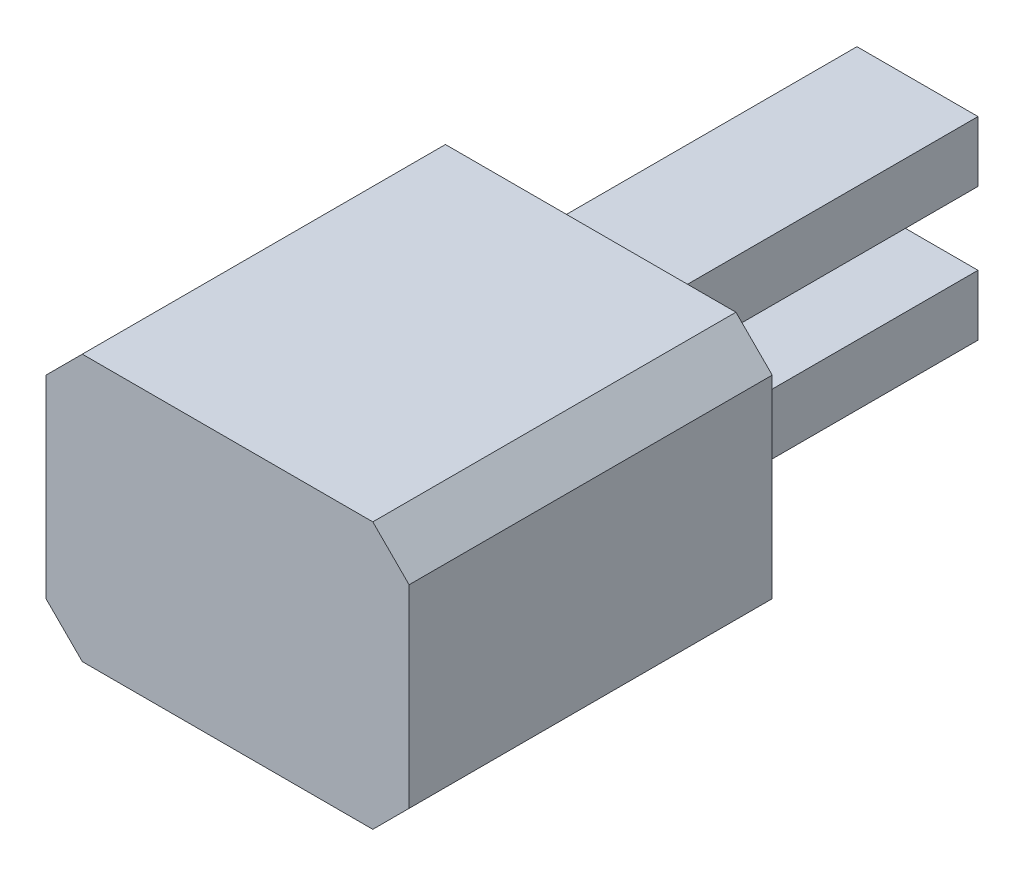
ISO-10303-21;
HEADER;
FILE_DESCRIPTION(('STEP AP214'),'2;1');
FILE_NAME('part.step','',(''),(''),'','','');
FILE_SCHEMA(('AUTOMOTIVE_DESIGN { 1 0 10303 214 1 1 1 1 }'));
ENDSEC;
DATA;
#1=APPLICATION_CONTEXT('core data for automotive mechanical design processes');
#2=APPLICATION_PROTOCOL_DEFINITION('international standard','automotive_design',2000,#1);
#3=PRODUCT_CONTEXT('',#1,'mechanical');
#4=PRODUCT('Part','Part','',(#3));
#5=PRODUCT_RELATED_PRODUCT_CATEGORY('part','',(#4));
#6=PRODUCT_DEFINITION_FORMATION('','',#4);
#7=PRODUCT_DEFINITION_CONTEXT('part definition',#1,'design');
#8=PRODUCT_DEFINITION('design','',#6,#7);
#9=PRODUCT_DEFINITION_SHAPE('','',#8);
#10=(LENGTH_UNIT() NAMED_UNIT(*) SI_UNIT(.MILLI.,.METRE.));
#11=(NAMED_UNIT(*) PLANE_ANGLE_UNIT() SI_UNIT($,.RADIAN.));
#12=(NAMED_UNIT(*) SI_UNIT($,.STERADIAN.) SOLID_ANGLE_UNIT());
#13=UNCERTAINTY_MEASURE_WITH_UNIT(LENGTH_MEASURE(1.E-05),#10,'distance_accuracy_value','');
#14=(GEOMETRIC_REPRESENTATION_CONTEXT(3) GLOBAL_UNCERTAINTY_ASSIGNED_CONTEXT((#13)) GLOBAL_UNIT_ASSIGNED_CONTEXT((#10,
#11,#12)) REPRESENTATION_CONTEXT('',''));
#15=CARTESIAN_POINT('',(0.,0.,0.));
#16=DIRECTION('',(0.,0.,1.));
#17=DIRECTION('',(1.,0.,0.));
#18=AXIS2_PLACEMENT_3D('',#15,#16,#17);
#19=CARTESIAN_POINT('',(0.,0.,-66.));
#20=DIRECTION('',(0.,0.,1.));
#21=DIRECTION('',(1.,0.,0.));
#22=AXIS2_PLACEMENT_3D('',#19,#20,#21);
#23=PLANE('',#22);
#24=DIRECTION('',(0.707106781186548,-0.707106781186548,0.));
#25=VECTOR('',#24,1.);
#26=CARTESIAN_POINT('',(-30.,-16.,-66.));
#27=LINE('',#26,#25);
#28=CARTESIAN_POINT('',(-30.,-16.,-66.));
#29=VERTEX_POINT('',#28);
#30=CARTESIAN_POINT('',(-24.,-22.,-66.));
#31=VERTEX_POINT('',#30);
#32=EDGE_CURVE('E220',#29,#31,#27,.T.);
#33=ORIENTED_EDGE('',*,*,#32,.F.);
#34=DIRECTION('',(0.,-1.,0.));
#35=VECTOR('',#34,1.);
#36=CARTESIAN_POINT('',(-30.,16.,-66.));
#37=LINE('',#36,#35);
#38=CARTESIAN_POINT('',(-30.,16.,-66.));
#39=VERTEX_POINT('',#38);
#40=EDGE_CURVE('E225',#39,#29,#37,.T.);
#41=ORIENTED_EDGE('',*,*,#40,.F.);
#42=DIRECTION('',(-0.707106781186548,-0.707106781186548,0.));
#43=VECTOR('',#42,1.);
#44=CARTESIAN_POINT('',(-24.,22.,-66.));
#45=LINE('',#44,#43);
#46=CARTESIAN_POINT('',(-24.,22.,-66.));
#47=VERTEX_POINT('',#46);
#48=EDGE_CURVE('E249',#47,#39,#45,.T.);
#49=ORIENTED_EDGE('',*,*,#48,.F.);
#50=DIRECTION('',(-1.,0.,0.));
#51=VECTOR('',#50,1.);
#52=CARTESIAN_POINT('',(24.,22.,-66.));
#53=LINE('',#52,#51);
#54=CARTESIAN_POINT('',(24.,22.,-66.));
#55=VERTEX_POINT('',#54);
#56=EDGE_CURVE('E250',#55,#47,#53,.T.);
#57=ORIENTED_EDGE('',*,*,#56,.F.);
#58=DIRECTION('',(-0.707106781186548,0.707106781186548,0.));
#59=VECTOR('',#58,1.);
#60=CARTESIAN_POINT('',(30.,16.,-66.));
#61=LINE('',#60,#59);
#62=CARTESIAN_POINT('',(30.,16.,-66.));
#63=VERTEX_POINT('',#62);
#64=EDGE_CURVE('E243',#63,#55,#61,.T.);
#65=ORIENTED_EDGE('',*,*,#64,.F.);
#66=DIRECTION('',(0.,1.,0.));
#67=VECTOR('',#66,1.);
#68=CARTESIAN_POINT('',(30.,-16.,-66.));
#69=LINE('',#68,#67);
#70=CARTESIAN_POINT('',(30.,-16.,-66.));
#71=VERTEX_POINT('',#70);
#72=EDGE_CURVE('E244',#71,#63,#69,.T.);
#73=ORIENTED_EDGE('',*,*,#72,.F.);
#74=DIRECTION('',(0.707106781186548,0.707106781186548,0.));
#75=VECTOR('',#74,1.);
#76=CARTESIAN_POINT('',(24.,-22.,-66.));
#77=LINE('',#76,#75);
#78=CARTESIAN_POINT('',(24.,-22.,-66.));
#79=VERTEX_POINT('',#78);
#80=EDGE_CURVE('E242',#79,#71,#77,.T.);
#81=ORIENTED_EDGE('',*,*,#80,.F.);
#82=DIRECTION('',(1.,0.,0.));
#83=VECTOR('',#82,1.);
#84=CARTESIAN_POINT('',(-24.,-22.,-66.));
#85=LINE('',#84,#83);
#86=EDGE_CURVE('E239',#31,#79,#85,.T.);
#87=ORIENTED_EDGE('',*,*,#86,.F.);
#88=EDGE_LOOP('',(#33,#41,#49,#57,#65,#73,#81,#87));
#89=FACE_BOUND('',#88,.T.);
#90=DIRECTION('',(-1.,0.,0.));
#91=VECTOR('',#90,1.);
#92=CARTESIAN_POINT('',(10.,16.,-66.));
#93=LINE('',#92,#91);
#94=CARTESIAN_POINT('',(10.,16.,-66.));
#95=VERTEX_POINT('',#94);
#96=CARTESIAN_POINT('',(-10.,16.,-66.));
#97=VERTEX_POINT('',#96);
#98=EDGE_CURVE('E191',#95,#97,#93,.T.);
#99=ORIENTED_EDGE('',*,*,#98,.T.);
#100=DIRECTION('',(0.,-1.,0.));
#101=VECTOR('',#100,1.);
#102=CARTESIAN_POINT('',(-10.,16.,-66.));
#103=LINE('',#102,#101);
#104=CARTESIAN_POINT('',(-10.,6.,-66.));
#105=VERTEX_POINT('',#104);
#106=EDGE_CURVE('E183',#97,#105,#103,.T.);
#107=ORIENTED_EDGE('',*,*,#106,.T.);
#108=DIRECTION('',(1.,0.,0.));
#109=VECTOR('',#108,1.);
#110=CARTESIAN_POINT('',(-10.,6.,-66.));
#111=LINE('',#110,#109);
#112=CARTESIAN_POINT('',(10.,6.,-66.));
#113=VERTEX_POINT('',#112);
#114=EDGE_CURVE('E189',#105,#113,#111,.T.);
#115=ORIENTED_EDGE('',*,*,#114,.T.);
#116=DIRECTION('',(0.,1.,0.));
#117=VECTOR('',#116,1.);
#118=CARTESIAN_POINT('',(10.,6.,-66.));
#119=LINE('',#118,#117);
#120=EDGE_CURVE('E195',#113,#95,#119,.T.);
#121=ORIENTED_EDGE('',*,*,#120,.T.);
#122=EDGE_LOOP('',(#99,#107,#115,#121));
#123=FACE_BOUND('',#122,.T.);
#124=DIRECTION('',(0.,-1.,0.));
#125=VECTOR('',#124,1.);
#126=CARTESIAN_POINT('',(-10.,-6.,-66.));
#127=LINE('',#126,#125);
#128=CARTESIAN_POINT('',(-10.,-6.,-66.));
#129=VERTEX_POINT('',#128);
#130=CARTESIAN_POINT('',(-10.,-16.,-66.));
#131=VERTEX_POINT('',#130);
#132=EDGE_CURVE('E53',#129,#131,#127,.T.);
#133=ORIENTED_EDGE('',*,*,#132,.T.);
#134=DIRECTION('',(1.,0.,0.));
#135=VECTOR('',#134,1.);
#136=CARTESIAN_POINT('',(-10.,-16.,-66.));
#137=LINE('',#136,#135);
#138=CARTESIAN_POINT('',(10.,-16.,-66.));
#139=VERTEX_POINT('',#138);
#140=EDGE_CURVE('E59',#131,#139,#137,.T.);
#141=ORIENTED_EDGE('',*,*,#140,.T.);
#142=DIRECTION('',(0.,1.,0.));
#143=VECTOR('',#142,1.);
#144=CARTESIAN_POINT('',(10.,-16.,-66.));
#145=LINE('',#144,#143);
#146=CARTESIAN_POINT('',(10.,-6.,-66.));
#147=VERTEX_POINT('',#146);
#148=EDGE_CURVE('E146',#139,#147,#145,.T.);
#149=ORIENTED_EDGE('',*,*,#148,.T.);
#150=DIRECTION('',(-1.,0.,0.));
#151=VECTOR('',#150,1.);
#152=CARTESIAN_POINT('',(10.,-6.,-66.));
#153=LINE('',#152,#151);
#154=EDGE_CURVE('E151',#147,#129,#153,.T.);
#155=ORIENTED_EDGE('',*,*,#154,.T.);
#156=EDGE_LOOP('',(#133,#141,#149,#155));
#157=FACE_BOUND('',#156,.T.);
#158=ADVANCED_FACE('F39',(#89,#123,#157),#23,.F.);
#159=CARTESIAN_POINT('',(-30.,-16.,-6.));
#160=DIRECTION('',(0.707106781186548,0.707106781186548,0.));
#161=DIRECTION('',(-0.707106781186548,0.707106781186548,0.));
#162=AXIS2_PLACEMENT_3D('',#159,#160,#161);
#163=PLANE('',#162);
#164=ORIENTED_EDGE('',*,*,#32,.T.);
#165=DIRECTION('',(0.,0.,-1.));
#166=VECTOR('',#165,1.);
#167=CARTESIAN_POINT('',(-24.,-22.,-6.));
#168=LINE('',#167,#166);
#169=CARTESIAN_POINT('',(-24.,-22.,-6.));
#170=VERTEX_POINT('',#169);
#171=EDGE_CURVE('E11',#170,#31,#168,.T.);
#172=ORIENTED_EDGE('',*,*,#171,.F.);
#173=DIRECTION('',(0.707106781186548,-0.707106781186548,0.));
#174=VECTOR('',#173,1.);
#175=CARTESIAN_POINT('',(-30.,-16.,-6.));
#176=LINE('',#175,#174);
#177=CARTESIAN_POINT('',(-30.,-16.,-6.));
#178=VERTEX_POINT('',#177);
#179=EDGE_CURVE('E217',#178,#170,#176,.T.);
#180=ORIENTED_EDGE('',*,*,#179,.F.);
#181=DIRECTION('',(0.,0.,-1.));
#182=VECTOR('',#181,1.);
#183=CARTESIAN_POINT('',(-30.,-16.,-6.));
#184=LINE('',#183,#182);
#185=EDGE_CURVE('E237',#178,#29,#184,.T.);
#186=ORIENTED_EDGE('',*,*,#185,.T.);
#187=EDGE_LOOP('',(#164,#172,#180,#186));
#188=FACE_BOUND('',#187,.T.);
#189=ADVANCED_FACE('F41',(#188),#163,.F.);
#190=CARTESIAN_POINT('',(-24.,-22.,-6.));
#191=DIRECTION('',(0.,1.,0.));
#192=DIRECTION('',(0.,0.,1.));
#193=AXIS2_PLACEMENT_3D('',#190,#191,#192);
#194=PLANE('',#193);
#195=ORIENTED_EDGE('',*,*,#86,.T.);
#196=DIRECTION('',(0.,0.,-1.));
#197=VECTOR('',#196,1.);
#198=CARTESIAN_POINT('',(24.,-22.,-6.));
#199=LINE('',#198,#197);
#200=CARTESIAN_POINT('',(24.,-22.,-6.));
#201=VERTEX_POINT('',#200);
#202=EDGE_CURVE('E50',#201,#79,#199,.T.);
#203=ORIENTED_EDGE('',*,*,#202,.F.);
#204=DIRECTION('',(1.,0.,0.));
#205=VECTOR('',#204,1.);
#206=CARTESIAN_POINT('',(-24.,-22.,-6.));
#207=LINE('',#206,#205);
#208=EDGE_CURVE('E222',#170,#201,#207,.T.);
#209=ORIENTED_EDGE('',*,*,#208,.F.);
#210=ORIENTED_EDGE('',*,*,#171,.T.);
#211=EDGE_LOOP('',(#195,#203,#209,#210));
#212=FACE_BOUND('',#211,.T.);
#213=ADVANCED_FACE('F297',(#212),#194,.F.);
#214=CARTESIAN_POINT('',(24.,-22.,-6.));
#215=DIRECTION('',(-0.707106781186548,0.707106781186548,0.));
#216=DIRECTION('',(-0.707106781186548,-0.707106781186548,0.));
#217=AXIS2_PLACEMENT_3D('',#214,#215,#216);
#218=PLANE('',#217);
#219=ORIENTED_EDGE('',*,*,#80,.T.);
#220=DIRECTION('',(0.,0.,-1.));
#221=VECTOR('',#220,1.);
#222=CARTESIAN_POINT('',(30.,-16.,-6.));
#223=LINE('',#222,#221);
#224=CARTESIAN_POINT('',(30.,-16.,-6.));
#225=VERTEX_POINT('',#224);
#226=EDGE_CURVE('E266',#225,#71,#223,.T.);
#227=ORIENTED_EDGE('',*,*,#226,.F.);
#228=DIRECTION('',(0.707106781186548,0.707106781186548,0.));
#229=VECTOR('',#228,1.);
#230=CARTESIAN_POINT('',(24.,-22.,-6.));
#231=LINE('',#230,#229);
#232=EDGE_CURVE('E221',#201,#225,#231,.T.);
#233=ORIENTED_EDGE('',*,*,#232,.F.);
#234=ORIENTED_EDGE('',*,*,#202,.T.);
#235=EDGE_LOOP('',(#219,#227,#233,#234));
#236=FACE_BOUND('',#235,.T.);
#237=ADVANCED_FACE('F272',(#236),#218,.F.);
#238=CARTESIAN_POINT('',(30.,-16.,-6.));
#239=DIRECTION('',(-1.,0.,0.));
#240=DIRECTION('',(0.,0.,1.));
#241=AXIS2_PLACEMENT_3D('',#238,#239,#240);
#242=PLANE('',#241);
#243=ORIENTED_EDGE('',*,*,#72,.T.);
#244=DIRECTION('',(0.,0.,-1.));
#245=VECTOR('',#244,1.);
#246=CARTESIAN_POINT('',(30.,16.,-6.));
#247=LINE('',#246,#245);
#248=CARTESIAN_POINT('',(30.,16.,-6.));
#249=VERTEX_POINT('',#248);
#250=EDGE_CURVE('E263',#249,#63,#247,.T.);
#251=ORIENTED_EDGE('',*,*,#250,.F.);
#252=DIRECTION('',(0.,1.,0.));
#253=VECTOR('',#252,1.);
#254=CARTESIAN_POINT('',(30.,-16.,-6.));
#255=LINE('',#254,#253);
#256=EDGE_CURVE('E227',#225,#249,#255,.T.);
#257=ORIENTED_EDGE('',*,*,#256,.F.);
#258=ORIENTED_EDGE('',*,*,#226,.T.);
#259=EDGE_LOOP('',(#243,#251,#257,#258));
#260=FACE_BOUND('',#259,.T.);
#261=ADVANCED_FACE('F281',(#260),#242,.F.);
#262=CARTESIAN_POINT('',(30.,16.,-6.));
#263=DIRECTION('',(-0.707106781186548,-0.707106781186548,0.));
#264=DIRECTION('',(0.707106781186548,-0.707106781186548,0.));
#265=AXIS2_PLACEMENT_3D('',#262,#263,#264);
#266=PLANE('',#265);
#267=ORIENTED_EDGE('',*,*,#64,.T.);
#268=DIRECTION('',(0.,0.,-1.));
#269=VECTOR('',#268,1.);
#270=CARTESIAN_POINT('',(24.,22.,-6.));
#271=LINE('',#270,#269);
#272=CARTESIAN_POINT('',(24.,22.,-6.));
#273=VERTEX_POINT('',#272);
#274=EDGE_CURVE('E257',#273,#55,#271,.T.);
#275=ORIENTED_EDGE('',*,*,#274,.F.);
#276=DIRECTION('',(-0.707106781186548,0.707106781186548,0.));
#277=VECTOR('',#276,1.);
#278=CARTESIAN_POINT('',(30.,16.,-6.));
#279=LINE('',#278,#277);
#280=EDGE_CURVE('E229',#249,#273,#279,.T.);
#281=ORIENTED_EDGE('',*,*,#280,.F.);
#282=ORIENTED_EDGE('',*,*,#250,.T.);
#283=EDGE_LOOP('',(#267,#275,#281,#282));
#284=FACE_BOUND('',#283,.T.);
#285=ADVANCED_FACE('F288',(#284),#266,.F.);
#286=CARTESIAN_POINT('',(24.,22.,-6.));
#287=DIRECTION('',(0.,-1.,0.));
#288=DIRECTION('',(0.,0.,-1.));
#289=AXIS2_PLACEMENT_3D('',#286,#287,#288);
#290=PLANE('',#289);
#291=ORIENTED_EDGE('',*,*,#56,.T.);
#292=DIRECTION('',(0.,0.,-1.));
#293=VECTOR('',#292,1.);
#294=CARTESIAN_POINT('',(-24.,22.,-6.));
#295=LINE('',#294,#293);
#296=CARTESIAN_POINT('',(-24.,22.,-6.));
#297=VERTEX_POINT('',#296);
#298=EDGE_CURVE('E260',#297,#47,#295,.T.);
#299=ORIENTED_EDGE('',*,*,#298,.F.);
#300=DIRECTION('',(-1.,0.,0.));
#301=VECTOR('',#300,1.);
#302=CARTESIAN_POINT('',(24.,22.,-6.));
#303=LINE('',#302,#301);
#304=EDGE_CURVE('E228',#273,#297,#303,.T.);
#305=ORIENTED_EDGE('',*,*,#304,.F.);
#306=ORIENTED_EDGE('',*,*,#274,.T.);
#307=EDGE_LOOP('',(#291,#299,#305,#306));
#308=FACE_BOUND('',#307,.T.);
#309=ADVANCED_FACE('F310',(#308),#290,.F.);
#310=CARTESIAN_POINT('',(-24.,22.,-6.));
#311=DIRECTION('',(0.707106781186548,-0.707106781186548,0.));
#312=DIRECTION('',(0.707106781186548,0.707106781186548,0.));
#313=AXIS2_PLACEMENT_3D('',#310,#311,#312);
#314=PLANE('',#313);
#315=ORIENTED_EDGE('',*,*,#48,.T.);
#316=DIRECTION('',(0.,0.,-1.));
#317=VECTOR('',#316,1.);
#318=CARTESIAN_POINT('',(-30.,16.,-6.));
#319=LINE('',#318,#317);
#320=CARTESIAN_POINT('',(-30.,16.,-6.));
#321=VERTEX_POINT('',#320);
#322=EDGE_CURVE('E255',#321,#39,#319,.T.);
#323=ORIENTED_EDGE('',*,*,#322,.F.);
#324=DIRECTION('',(-0.707106781186548,-0.707106781186548,0.));
#325=VECTOR('',#324,1.);
#326=CARTESIAN_POINT('',(-24.,22.,-6.));
#327=LINE('',#326,#325);
#328=EDGE_CURVE('E235',#297,#321,#327,.T.);
#329=ORIENTED_EDGE('',*,*,#328,.F.);
#330=ORIENTED_EDGE('',*,*,#298,.T.);
#331=EDGE_LOOP('',(#315,#323,#329,#330));
#332=FACE_BOUND('',#331,.T.);
#333=ADVANCED_FACE('F307',(#332),#314,.F.);
#334=CARTESIAN_POINT('',(-30.,16.,-6.));
#335=DIRECTION('',(1.,0.,0.));
#336=DIRECTION('',(0.,0.,-1.));
#337=AXIS2_PLACEMENT_3D('',#334,#335,#336);
#338=PLANE('',#337);
#339=ORIENTED_EDGE('',*,*,#40,.T.);
#340=ORIENTED_EDGE('',*,*,#185,.F.);
#341=DIRECTION('',(0.,-1.,0.));
#342=VECTOR('',#341,1.);
#343=CARTESIAN_POINT('',(-30.,16.,-6.));
#344=LINE('',#343,#342);
#345=EDGE_CURVE('E234',#321,#178,#344,.T.);
#346=ORIENTED_EDGE('',*,*,#345,.F.);
#347=ORIENTED_EDGE('',*,*,#322,.T.);
#348=EDGE_LOOP('',(#339,#340,#346,#347));
#349=FACE_BOUND('',#348,.T.);
#350=ADVANCED_FACE('F305',(#349),#338,.F.);
#351=CARTESIAN_POINT('',(0.,0.,-6.));
#352=DIRECTION('',(0.,0.,1.));
#353=DIRECTION('',(1.,0.,0.));
#354=AXIS2_PLACEMENT_3D('',#351,#352,#353);
#355=PLANE('',#354);
#356=ORIENTED_EDGE('',*,*,#179,.T.);
#357=ORIENTED_EDGE('',*,*,#208,.T.);
#358=ORIENTED_EDGE('',*,*,#232,.T.);
#359=ORIENTED_EDGE('',*,*,#256,.T.);
#360=ORIENTED_EDGE('',*,*,#280,.T.);
#361=ORIENTED_EDGE('',*,*,#304,.T.);
#362=ORIENTED_EDGE('',*,*,#328,.T.);
#363=ORIENTED_EDGE('',*,*,#345,.T.);
#364=EDGE_LOOP('',(#356,#357,#358,#359,#360,#361,#362,#363));
#365=FACE_BOUND('',#364,.T.);
#366=ADVANCED_FACE('F295',(#365),#355,.T.);
#367=CARTESIAN_POINT('',(-10.,16.,-66.));
#368=DIRECTION('',(1.,0.,0.));
#369=DIRECTION('',(0.,0.,-1.));
#370=AXIS2_PLACEMENT_3D('',#367,#368,#369);
#371=PLANE('',#370);
#372=DIRECTION('',(0.,-1.,0.));
#373=VECTOR('',#372,1.);
#374=CARTESIAN_POINT('',(-10.,16.,-120.));
#375=LINE('',#374,#373);
#376=CARTESIAN_POINT('',(-10.,16.,-120.));
#377=VERTEX_POINT('',#376);
#378=CARTESIAN_POINT('',(-10.,6.,-120.));
#379=VERTEX_POINT('',#378);
#380=EDGE_CURVE('E184',#377,#379,#375,.T.);
#381=ORIENTED_EDGE('',*,*,#380,.T.);
#382=DIRECTION('',(0.,0.,-1.));
#383=VECTOR('',#382,1.);
#384=CARTESIAN_POINT('',(-10.,6.,-66.));
#385=LINE('',#384,#383);
#386=EDGE_CURVE('E212',#105,#379,#385,.T.);
#387=ORIENTED_EDGE('',*,*,#386,.F.);
#388=ORIENTED_EDGE('',*,*,#106,.F.);
#389=DIRECTION('',(0.,0.,-1.));
#390=VECTOR('',#389,1.);
#391=CARTESIAN_POINT('',(-10.,16.,-66.));
#392=LINE('',#391,#390);
#393=EDGE_CURVE('E196',#97,#377,#392,.T.);
#394=ORIENTED_EDGE('',*,*,#393,.T.);
#395=EDGE_LOOP('',(#381,#387,#388,#394));
#396=FACE_BOUND('',#395,.T.);
#397=ADVANCED_FACE('F335',(#396),#371,.F.);
#398=CARTESIAN_POINT('',(-10.,6.,-66.));
#399=DIRECTION('',(0.,1.,0.));
#400=DIRECTION('',(0.,0.,1.));
#401=AXIS2_PLACEMENT_3D('',#398,#399,#400);
#402=PLANE('',#401);
#403=DIRECTION('',(1.,0.,0.));
#404=VECTOR('',#403,1.);
#405=CARTESIAN_POINT('',(-10.,6.,-120.));
#406=LINE('',#405,#404);
#407=CARTESIAN_POINT('',(10.,6.,-120.));
#408=VERTEX_POINT('',#407);
#409=EDGE_CURVE('E203',#379,#408,#406,.T.);
#410=ORIENTED_EDGE('',*,*,#409,.T.);
#411=DIRECTION('',(0.,0.,-1.));
#412=VECTOR('',#411,1.);
#413=CARTESIAN_POINT('',(10.,6.,-66.));
#414=LINE('',#413,#412);
#415=EDGE_CURVE('E211',#113,#408,#414,.T.);
#416=ORIENTED_EDGE('',*,*,#415,.F.);
#417=ORIENTED_EDGE('',*,*,#114,.F.);
#418=ORIENTED_EDGE('',*,*,#386,.T.);
#419=EDGE_LOOP('',(#410,#416,#417,#418));
#420=FACE_BOUND('',#419,.T.);
#421=ADVANCED_FACE('F337',(#420),#402,.F.);
#422=CARTESIAN_POINT('',(10.,6.,-66.));
#423=DIRECTION('',(-1.,0.,0.));
#424=DIRECTION('',(0.,0.,1.));
#425=AXIS2_PLACEMENT_3D('',#422,#423,#424);
#426=PLANE('',#425);
#427=DIRECTION('',(0.,1.,0.));
#428=VECTOR('',#427,1.);
#429=CARTESIAN_POINT('',(10.,6.,-120.));
#430=LINE('',#429,#428);
#431=CARTESIAN_POINT('',(10.,16.,-120.));
#432=VERTEX_POINT('',#431);
#433=EDGE_CURVE('E201',#408,#432,#430,.T.);
#434=ORIENTED_EDGE('',*,*,#433,.T.);
#435=DIRECTION('',(0.,0.,-1.));
#436=VECTOR('',#435,1.);
#437=CARTESIAN_POINT('',(10.,16.,-66.));
#438=LINE('',#437,#436);
#439=EDGE_CURVE('E208',#95,#432,#438,.T.);
#440=ORIENTED_EDGE('',*,*,#439,.F.);
#441=ORIENTED_EDGE('',*,*,#120,.F.);
#442=ORIENTED_EDGE('',*,*,#415,.T.);
#443=EDGE_LOOP('',(#434,#440,#441,#442));
#444=FACE_BOUND('',#443,.T.);
#445=ADVANCED_FACE('F342',(#444),#426,.F.);
#446=CARTESIAN_POINT('',(10.,16.,-66.));
#447=DIRECTION('',(0.,-1.,0.));
#448=DIRECTION('',(0.,0.,-1.));
#449=AXIS2_PLACEMENT_3D('',#446,#447,#448);
#450=PLANE('',#449);
#451=DIRECTION('',(-1.,0.,0.));
#452=VECTOR('',#451,1.);
#453=CARTESIAN_POINT('',(10.,16.,-120.));
#454=LINE('',#453,#452);
#455=EDGE_CURVE('E186',#432,#377,#454,.T.);
#456=ORIENTED_EDGE('',*,*,#455,.T.);
#457=ORIENTED_EDGE('',*,*,#393,.F.);
#458=ORIENTED_EDGE('',*,*,#98,.F.);
#459=ORIENTED_EDGE('',*,*,#439,.T.);
#460=EDGE_LOOP('',(#456,#457,#458,#459));
#461=FACE_BOUND('',#460,.T.);
#462=ADVANCED_FACE('F350',(#461),#450,.F.);
#463=CARTESIAN_POINT('',(0.,0.,-120.));
#464=DIRECTION('',(0.,0.,1.));
#465=DIRECTION('',(1.,0.,0.));
#466=AXIS2_PLACEMENT_3D('',#463,#464,#465);
#467=PLANE('',#466);
#468=ORIENTED_EDGE('',*,*,#380,.F.);
#469=ORIENTED_EDGE('',*,*,#455,.F.);
#470=ORIENTED_EDGE('',*,*,#433,.F.);
#471=ORIENTED_EDGE('',*,*,#409,.F.);
#472=EDGE_LOOP('',(#468,#469,#470,#471));
#473=FACE_BOUND('',#472,.T.);
#474=ADVANCED_FACE('F352',(#473),#467,.F.);
#475=CARTESIAN_POINT('',(-10.,-6.,-66.));
#476=DIRECTION('',(1.,0.,0.));
#477=DIRECTION('',(0.,0.,-1.));
#478=AXIS2_PLACEMENT_3D('',#475,#476,#477);
#479=PLANE('',#478);
#480=DIRECTION('',(0.,-1.,0.));
#481=VECTOR('',#480,1.);
#482=CARTESIAN_POINT('',(-10.,-6.,-120.));
#483=LINE('',#482,#481);
#484=CARTESIAN_POINT('',(-10.,-6.,-120.));
#485=VERTEX_POINT('',#484);
#486=CARTESIAN_POINT('',(-10.,-16.,-120.));
#487=VERTEX_POINT('',#486);
#488=EDGE_CURVE('E175',#485,#487,#483,.T.);
#489=ORIENTED_EDGE('',*,*,#488,.T.);
#490=DIRECTION('',(0.,0.,-1.));
#491=VECTOR('',#490,1.);
#492=CARTESIAN_POINT('',(-10.,-16.,-66.));
#493=LINE('',#492,#491);
#494=EDGE_CURVE('E182',#131,#487,#493,.T.);
#495=ORIENTED_EDGE('',*,*,#494,.F.);
#496=ORIENTED_EDGE('',*,*,#132,.F.);
#497=DIRECTION('',(0.,0.,-1.));
#498=VECTOR('',#497,1.);
#499=CARTESIAN_POINT('',(-10.,-6.,-66.));
#500=LINE('',#499,#498);
#501=EDGE_CURVE('E163',#129,#485,#500,.T.);
#502=ORIENTED_EDGE('',*,*,#501,.T.);
#503=EDGE_LOOP('',(#489,#495,#496,#502));
#504=FACE_BOUND('',#503,.T.);
#505=ADVANCED_FACE('F351',(#504),#479,.F.);
#506=CARTESIAN_POINT('',(-10.,-16.,-66.));
#507=DIRECTION('',(0.,1.,0.));
#508=DIRECTION('',(0.,0.,1.));
#509=AXIS2_PLACEMENT_3D('',#506,#507,#508);
#510=PLANE('',#509);
#511=DIRECTION('',(1.,0.,0.));
#512=VECTOR('',#511,1.);
#513=CARTESIAN_POINT('',(-10.,-16.,-120.));
#514=LINE('',#513,#512);
#515=CARTESIAN_POINT('',(10.,-16.,-120.));
#516=VERTEX_POINT('',#515);
#517=EDGE_CURVE('E173',#487,#516,#514,.T.);
#518=ORIENTED_EDGE('',*,*,#517,.T.);
#519=DIRECTION('',(0.,0.,-1.));
#520=VECTOR('',#519,1.);
#521=CARTESIAN_POINT('',(10.,-16.,-66.));
#522=LINE('',#521,#520);
#523=EDGE_CURVE('E162',#139,#516,#522,.T.);
#524=ORIENTED_EDGE('',*,*,#523,.F.);
#525=ORIENTED_EDGE('',*,*,#140,.F.);
#526=ORIENTED_EDGE('',*,*,#494,.T.);
#527=EDGE_LOOP('',(#518,#524,#525,#526));
#528=FACE_BOUND('',#527,.T.);
#529=ADVANCED_FACE('F360',(#528),#510,.F.);
#530=CARTESIAN_POINT('',(10.,-16.,-66.));
#531=DIRECTION('',(-1.,0.,0.));
#532=DIRECTION('',(0.,0.,1.));
#533=AXIS2_PLACEMENT_3D('',#530,#531,#532);
#534=PLANE('',#533);
#535=DIRECTION('',(0.,1.,0.));
#536=VECTOR('',#535,1.);
#537=CARTESIAN_POINT('',(10.,-16.,-120.));
#538=LINE('',#537,#536);
#539=CARTESIAN_POINT('',(10.,-6.,-120.));
#540=VERTEX_POINT('',#539);
#541=EDGE_CURVE('E159',#516,#540,#538,.T.);
#542=ORIENTED_EDGE('',*,*,#541,.T.);
#543=DIRECTION('',(0.,0.,-1.));
#544=VECTOR('',#543,1.);
#545=CARTESIAN_POINT('',(10.,-6.,-66.));
#546=LINE('',#545,#544);
#547=EDGE_CURVE('E160',#147,#540,#546,.T.);
#548=ORIENTED_EDGE('',*,*,#547,.F.);
#549=ORIENTED_EDGE('',*,*,#148,.F.);
#550=ORIENTED_EDGE('',*,*,#523,.T.);
#551=EDGE_LOOP('',(#542,#548,#549,#550));
#552=FACE_BOUND('',#551,.T.);
#553=ADVANCED_FACE('F158',(#552),#534,.F.);
#554=CARTESIAN_POINT('',(10.,-6.,-66.));
#555=DIRECTION('',(0.,-1.,0.));
#556=DIRECTION('',(0.,0.,-1.));
#557=AXIS2_PLACEMENT_3D('',#554,#555,#556);
#558=PLANE('',#557);
#559=DIRECTION('',(-1.,0.,0.));
#560=VECTOR('',#559,1.);
#561=CARTESIAN_POINT('',(10.,-6.,-120.));
#562=LINE('',#561,#560);
#563=EDGE_CURVE('E178',#540,#485,#562,.T.);
#564=ORIENTED_EDGE('',*,*,#563,.T.);
#565=ORIENTED_EDGE('',*,*,#501,.F.);
#566=ORIENTED_EDGE('',*,*,#154,.F.);
#567=ORIENTED_EDGE('',*,*,#547,.T.);
#568=EDGE_LOOP('',(#564,#565,#566,#567));
#569=FACE_BOUND('',#568,.T.);
#570=ADVANCED_FACE('F167',(#569),#558,.F.);
#571=CARTESIAN_POINT('',(0.,0.,-120.));
#572=DIRECTION('',(0.,0.,1.));
#573=DIRECTION('',(1.,0.,0.));
#574=AXIS2_PLACEMENT_3D('',#571,#572,#573);
#575=PLANE('',#574);
#576=ORIENTED_EDGE('',*,*,#488,.F.);
#577=ORIENTED_EDGE('',*,*,#563,.F.);
#578=ORIENTED_EDGE('',*,*,#541,.F.);
#579=ORIENTED_EDGE('',*,*,#517,.F.);
#580=EDGE_LOOP('',(#576,#577,#578,#579));
#581=FACE_BOUND('',#580,.T.);
#582=ADVANCED_FACE('F368',(#581),#575,.F.);
#583=CLOSED_SHELL('',(#158,#189,#213,#237,#261,#285,#309,#333,#350,#366,#397,#421,#445,#462,
#474,#505,#529,#553,#570,#582));
#584=MANIFOLD_SOLID_BREP('B2',#583);
#585=ADVANCED_BREP_SHAPE_REPRESENTATION('',(#18,#584),#14);
#586=SHAPE_DEFINITION_REPRESENTATION(#9,#585);
ENDSEC;
END-ISO-10303-21;
